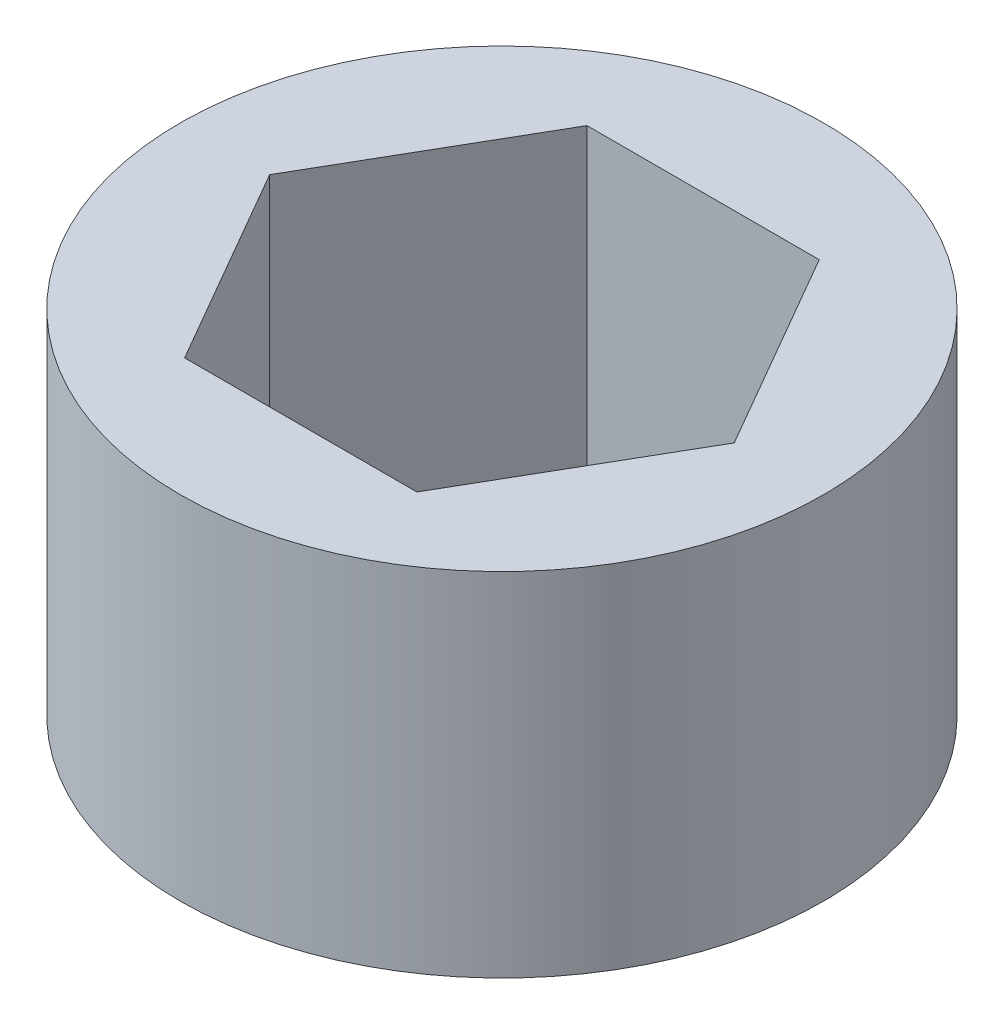
ISO-10303-21;
HEADER;
FILE_DESCRIPTION(('STEP AP214'),'2;1');
FILE_NAME('part.step','',(''),(''),'','','');
FILE_SCHEMA(('AUTOMOTIVE_DESIGN { 1 0 10303 214 1 1 1 1 }'));
ENDSEC;
DATA;
#1=APPLICATION_CONTEXT('core data for automotive mechanical design processes');
#2=APPLICATION_PROTOCOL_DEFINITION('international standard','automotive_design',2000,#1);
#3=PRODUCT_CONTEXT('',#1,'mechanical');
#4=PRODUCT('Part','Part','',(#3));
#5=PRODUCT_RELATED_PRODUCT_CATEGORY('part','',(#4));
#6=PRODUCT_DEFINITION_FORMATION('','',#4);
#7=PRODUCT_DEFINITION_CONTEXT('part definition',#1,'design');
#8=PRODUCT_DEFINITION('design','',#6,#7);
#9=PRODUCT_DEFINITION_SHAPE('','',#8);
#10=(LENGTH_UNIT() NAMED_UNIT(*) SI_UNIT(.MILLI.,.METRE.));
#11=(NAMED_UNIT(*) PLANE_ANGLE_UNIT() SI_UNIT($,.RADIAN.));
#12=(NAMED_UNIT(*) SI_UNIT($,.STERADIAN.) SOLID_ANGLE_UNIT());
#13=UNCERTAINTY_MEASURE_WITH_UNIT(LENGTH_MEASURE(1.E-05),#10,'distance_accuracy_value','');
#14=(GEOMETRIC_REPRESENTATION_CONTEXT(3) GLOBAL_UNCERTAINTY_ASSIGNED_CONTEXT((#13)) GLOBAL_UNIT_ASSIGNED_CONTEXT((#10,
#11,#12)) REPRESENTATION_CONTEXT('',''));
#15=CARTESIAN_POINT('',(0.,0.,0.));
#16=DIRECTION('',(0.,0.,1.));
#17=DIRECTION('',(1.,0.,0.));
#18=AXIS2_PLACEMENT_3D('',#15,#16,#17);
#19=CARTESIAN_POINT('',(0.,11.1125,0.));
#20=DIRECTION('',(0.,1.,0.));
#21=DIRECTION('',(0.,0.,1.));
#22=AXIS2_PLACEMENT_3D('',#19,#20,#21);
#23=PLANE('',#22);
#24=CARTESIAN_POINT('',(0.,11.1125,0.));
#25=DIRECTION('',(0.,1.,0.));
#26=DIRECTION('',(0.,0.,1.));
#27=AXIS2_PLACEMENT_3D('',#24,#25,#26);
#28=CIRCLE('',#27,10.16);
#29=CARTESIAN_POINT('',(0.,11.1125,10.16));
#30=VERTEX_POINT('',#29);
#31=EDGE_CURVE('E11',#30,#30,#28,.T.);
#32=ORIENTED_EDGE('',*,*,#31,.T.);
#33=EDGE_LOOP('',(#32));
#34=FACE_BOUND('',#33,.T.);
#35=DIRECTION('',(0.5,0.,-0.866025403784438));
#36=VECTOR('',#35,1.);
#37=CARTESIAN_POINT('',(3.66617420935412,11.1125,6.35));
#38=LINE('',#37,#36);
#39=CARTESIAN_POINT('',(3.66617420935412,11.1125,6.35));
#40=VERTEX_POINT('',#39);
#41=CARTESIAN_POINT('',(7.33234841870825,11.1125,0.));
#42=VERTEX_POINT('',#41);
#43=EDGE_CURVE('E102',#40,#42,#38,.T.);
#44=ORIENTED_EDGE('',*,*,#43,.F.);
#45=DIRECTION('',(1.,0.,0.));
#46=VECTOR('',#45,1.);
#47=CARTESIAN_POINT('',(-3.66617420935412,11.1125,6.35));
#48=LINE('',#47,#46);
#49=CARTESIAN_POINT('',(-3.66617420935412,11.1125,6.35));
#50=VERTEX_POINT('',#49);
#51=EDGE_CURVE('E93',#50,#40,#48,.T.);
#52=ORIENTED_EDGE('',*,*,#51,.F.);
#53=DIRECTION('',(0.5,0.,0.866025403784438));
#54=VECTOR('',#53,1.);
#55=CARTESIAN_POINT('',(-7.33234841870825,11.1125,0.));
#56=LINE('',#55,#54);
#57=CARTESIAN_POINT('',(-7.33234841870825,11.1125,0.));
#58=VERTEX_POINT('',#57);
#59=EDGE_CURVE('E127',#58,#50,#56,.T.);
#60=ORIENTED_EDGE('',*,*,#59,.F.);
#61=DIRECTION('',(-0.5,0.,0.866025403784439));
#62=VECTOR('',#61,1.);
#63=CARTESIAN_POINT('',(-3.66617420935413,11.1125,-6.35));
#64=LINE('',#63,#62);
#65=CARTESIAN_POINT('',(-3.66617420935413,11.1125,-6.35));
#66=VERTEX_POINT('',#65);
#67=EDGE_CURVE('E124',#66,#58,#64,.T.);
#68=ORIENTED_EDGE('',*,*,#67,.F.);
#69=DIRECTION('',(-1.,0.,0.));
#70=VECTOR('',#69,1.);
#71=CARTESIAN_POINT('',(3.66617420935412,11.1125,-6.35));
#72=LINE('',#71,#70);
#73=CARTESIAN_POINT('',(3.66617420935412,11.1125,-6.35));
#74=VERTEX_POINT('',#73);
#75=EDGE_CURVE('E119',#74,#66,#72,.T.);
#76=ORIENTED_EDGE('',*,*,#75,.F.);
#77=DIRECTION('',(-0.5,0.,-0.866025403784439));
#78=VECTOR('',#77,1.);
#79=CARTESIAN_POINT('',(7.33234841870825,11.1125,0.));
#80=LINE('',#79,#78);
#81=EDGE_CURVE('E115',#42,#74,#80,.T.);
#82=ORIENTED_EDGE('',*,*,#81,.F.);
#83=EDGE_LOOP('',(#44,#52,#60,#68,#76,#82));
#84=FACE_BOUND('',#83,.T.);
#85=ADVANCED_FACE('F39',(#34,#84),#23,.T.);
#86=CARTESIAN_POINT('',(0.,0.,0.));
#87=DIRECTION('',(0.,1.,0.));
#88=DIRECTION('',(0.,0.,1.));
#89=AXIS2_PLACEMENT_3D('',#86,#87,#88);
#90=PLANE('',#89);
#91=CARTESIAN_POINT('',(0.,0.,0.));
#92=DIRECTION('',(0.,1.,0.));
#93=DIRECTION('',(0.,0.,1.));
#94=AXIS2_PLACEMENT_3D('',#91,#92,#93);
#95=CIRCLE('',#94,10.16);
#96=CARTESIAN_POINT('',(0.,0.,10.16));
#97=VERTEX_POINT('',#96);
#98=EDGE_CURVE('E43',#97,#97,#95,.T.);
#99=ORIENTED_EDGE('',*,*,#98,.F.);
#100=EDGE_LOOP('',(#99));
#101=FACE_BOUND('',#100,.T.);
#102=DIRECTION('',(1.,0.,0.));
#103=VECTOR('',#102,1.);
#104=CARTESIAN_POINT('',(-3.66617420935412,0.,6.35));
#105=LINE('',#104,#103);
#106=CARTESIAN_POINT('',(-3.66617420935412,0.,6.35));
#107=VERTEX_POINT('',#106);
#108=CARTESIAN_POINT('',(3.66617420935412,0.,6.35));
#109=VERTEX_POINT('',#108);
#110=EDGE_CURVE('E63',#107,#109,#105,.T.);
#111=ORIENTED_EDGE('',*,*,#110,.T.);
#112=DIRECTION('',(0.5,0.,-0.866025403784438));
#113=VECTOR('',#112,1.);
#114=CARTESIAN_POINT('',(3.66617420935412,0.,6.35));
#115=LINE('',#114,#113);
#116=CARTESIAN_POINT('',(7.33234841870825,0.,0.));
#117=VERTEX_POINT('',#116);
#118=EDGE_CURVE('E109',#109,#117,#115,.T.);
#119=ORIENTED_EDGE('',*,*,#118,.T.);
#120=DIRECTION('',(-0.5,0.,-0.866025403784439));
#121=VECTOR('',#120,1.);
#122=CARTESIAN_POINT('',(7.33234841870825,0.,0.));
#123=LINE('',#122,#121);
#124=CARTESIAN_POINT('',(3.66617420935412,0.,-6.35));
#125=VERTEX_POINT('',#124);
#126=EDGE_CURVE('E134',#117,#125,#123,.T.);
#127=ORIENTED_EDGE('',*,*,#126,.T.);
#128=DIRECTION('',(-1.,0.,0.));
#129=VECTOR('',#128,1.);
#130=CARTESIAN_POINT('',(3.66617420935412,0.,-6.35));
#131=LINE('',#130,#129);
#132=CARTESIAN_POINT('',(-3.66617420935413,0.,-6.35));
#133=VERTEX_POINT('',#132);
#134=EDGE_CURVE('E138',#125,#133,#131,.T.);
#135=ORIENTED_EDGE('',*,*,#134,.T.);
#136=DIRECTION('',(-0.5,0.,0.866025403784439));
#137=VECTOR('',#136,1.);
#138=CARTESIAN_POINT('',(-3.66617420935413,0.,-6.35));
#139=LINE('',#138,#137);
#140=CARTESIAN_POINT('',(-7.33234841870825,0.,0.));
#141=VERTEX_POINT('',#140);
#142=EDGE_CURVE('E142',#133,#141,#139,.T.);
#143=ORIENTED_EDGE('',*,*,#142,.T.);
#144=DIRECTION('',(0.5,0.,0.866025403784438));
#145=VECTOR('',#144,1.);
#146=CARTESIAN_POINT('',(-7.33234841870825,0.,0.));
#147=LINE('',#146,#145);
#148=EDGE_CURVE('E103',#141,#107,#147,.T.);
#149=ORIENTED_EDGE('',*,*,#148,.T.);
#150=EDGE_LOOP('',(#111,#119,#127,#135,#143,#149));
#151=FACE_BOUND('',#150,.T.);
#152=ADVANCED_FACE('F166',(#101,#151),#90,.F.);
#153=CARTESIAN_POINT('',(0.,11.1125,0.));
#154=DIRECTION('',(0.,-1.,0.));
#155=DIRECTION('',(0.,0.,-1.));
#156=AXIS2_PLACEMENT_3D('',#153,#154,#155);
#157=CYLINDRICAL_SURFACE('',#156,10.16);
#158=ORIENTED_EDGE('',*,*,#31,.F.);
#159=EDGE_LOOP('',(#158));
#160=FACE_BOUND('',#159,.T.);
#161=ORIENTED_EDGE('',*,*,#98,.T.);
#162=EDGE_LOOP('',(#161));
#163=FACE_BOUND('',#162,.T.);
#164=ADVANCED_FACE('F41',(#160,#163),#157,.T.);
#165=CARTESIAN_POINT('',(-3.66617420935412,11.1125,6.35));
#166=DIRECTION('',(0.,0.,-1.));
#167=DIRECTION('',(-1.,0.,0.));
#168=AXIS2_PLACEMENT_3D('',#165,#166,#167);
#169=PLANE('',#168);
#170=ORIENTED_EDGE('',*,*,#110,.F.);
#171=DIRECTION('',(0.,-1.,0.));
#172=VECTOR('',#171,1.);
#173=CARTESIAN_POINT('',(-3.66617420935412,11.1125,6.35));
#174=LINE('',#173,#172);
#175=EDGE_CURVE('E97',#50,#107,#174,.T.);
#176=ORIENTED_EDGE('',*,*,#175,.F.);
#177=ORIENTED_EDGE('',*,*,#51,.T.);
#178=DIRECTION('',(0.,-1.,0.));
#179=VECTOR('',#178,1.);
#180=CARTESIAN_POINT('',(3.66617420935412,11.1125,6.35));
#181=LINE('',#180,#179);
#182=EDGE_CURVE('E96',#40,#109,#181,.T.);
#183=ORIENTED_EDGE('',*,*,#182,.T.);
#184=EDGE_LOOP('',(#170,#176,#177,#183));
#185=FACE_BOUND('',#184,.T.);
#186=ADVANCED_FACE('F95',(#185),#169,.T.);
#187=CARTESIAN_POINT('',(3.66617420935412,11.1125,6.35));
#188=DIRECTION('',(-0.866025403784438,0.,-0.5));
#189=DIRECTION('',(-0.5,0.,0.866025403784439));
#190=AXIS2_PLACEMENT_3D('',#187,#188,#189);
#191=PLANE('',#190);
#192=ORIENTED_EDGE('',*,*,#118,.F.);
#193=ORIENTED_EDGE('',*,*,#182,.F.);
#194=ORIENTED_EDGE('',*,*,#43,.T.);
#195=DIRECTION('',(0.,-1.,0.));
#196=VECTOR('',#195,1.);
#197=CARTESIAN_POINT('',(7.33234841870825,11.1125,0.));
#198=LINE('',#197,#196);
#199=EDGE_CURVE('E111',#42,#117,#198,.T.);
#200=ORIENTED_EDGE('',*,*,#199,.T.);
#201=EDGE_LOOP('',(#192,#193,#194,#200));
#202=FACE_BOUND('',#201,.T.);
#203=ADVANCED_FACE('F106',(#202),#191,.T.);
#204=CARTESIAN_POINT('',(7.33234841870825,11.1125,0.));
#205=DIRECTION('',(-0.866025403784438,0.,0.5));
#206=DIRECTION('',(0.5,0.,0.866025403784439));
#207=AXIS2_PLACEMENT_3D('',#204,#205,#206);
#208=PLANE('',#207);
#209=ORIENTED_EDGE('',*,*,#126,.F.);
#210=ORIENTED_EDGE('',*,*,#199,.F.);
#211=ORIENTED_EDGE('',*,*,#81,.T.);
#212=DIRECTION('',(0.,-1.,0.));
#213=VECTOR('',#212,1.);
#214=CARTESIAN_POINT('',(3.66617420935412,11.1125,-6.35));
#215=LINE('',#214,#213);
#216=EDGE_CURVE('E156',#74,#125,#215,.T.);
#217=ORIENTED_EDGE('',*,*,#216,.T.);
#218=EDGE_LOOP('',(#209,#210,#211,#217));
#219=FACE_BOUND('',#218,.T.);
#220=ADVANCED_FACE('F162',(#219),#208,.T.);
#221=CARTESIAN_POINT('',(3.66617420935412,11.1125,-6.35));
#222=DIRECTION('',(0.,0.,1.));
#223=DIRECTION('',(1.,0.,0.));
#224=AXIS2_PLACEMENT_3D('',#221,#222,#223);
#225=PLANE('',#224);
#226=ORIENTED_EDGE('',*,*,#134,.F.);
#227=ORIENTED_EDGE('',*,*,#216,.F.);
#228=ORIENTED_EDGE('',*,*,#75,.T.);
#229=DIRECTION('',(0.,-1.,0.));
#230=VECTOR('',#229,1.);
#231=CARTESIAN_POINT('',(-3.66617420935413,11.1125,-6.35));
#232=LINE('',#231,#230);
#233=EDGE_CURVE('E153',#66,#133,#232,.T.);
#234=ORIENTED_EDGE('',*,*,#233,.T.);
#235=EDGE_LOOP('',(#226,#227,#228,#234));
#236=FACE_BOUND('',#235,.T.);
#237=ADVANCED_FACE('F174',(#236),#225,.T.);
#238=CARTESIAN_POINT('',(-3.66617420935413,11.1125,-6.35));
#239=DIRECTION('',(0.866025403784438,0.,0.5));
#240=DIRECTION('',(0.5,0.,-0.866025403784439));
#241=AXIS2_PLACEMENT_3D('',#238,#239,#240);
#242=PLANE('',#241);
#243=ORIENTED_EDGE('',*,*,#142,.F.);
#244=ORIENTED_EDGE('',*,*,#233,.F.);
#245=ORIENTED_EDGE('',*,*,#67,.T.);
#246=DIRECTION('',(0.,-1.,0.));
#247=VECTOR('',#246,1.);
#248=CARTESIAN_POINT('',(-7.33234841870825,11.1125,0.));
#249=LINE('',#248,#247);
#250=EDGE_CURVE('E55',#58,#141,#249,.T.);
#251=ORIENTED_EDGE('',*,*,#250,.T.);
#252=EDGE_LOOP('',(#243,#244,#245,#251));
#253=FACE_BOUND('',#252,.T.);
#254=ADVANCED_FACE('F172',(#253),#242,.T.);
#255=CARTESIAN_POINT('',(-7.33234841870825,11.1125,0.));
#256=DIRECTION('',(0.866025403784438,0.,-0.5));
#257=DIRECTION('',(-0.5,0.,-0.866025403784439));
#258=AXIS2_PLACEMENT_3D('',#255,#256,#257);
#259=PLANE('',#258);
#260=ORIENTED_EDGE('',*,*,#148,.F.);
#261=ORIENTED_EDGE('',*,*,#250,.F.);
#262=ORIENTED_EDGE('',*,*,#59,.T.);
#263=ORIENTED_EDGE('',*,*,#175,.T.);
#264=EDGE_LOOP('',(#260,#261,#262,#263));
#265=FACE_BOUND('',#264,.T.);
#266=ADVANCED_FACE('F168',(#265),#259,.T.);
#267=CLOSED_SHELL('',(#85,#152,#164,#186,#203,#220,#237,#254,#266));
#268=MANIFOLD_SOLID_BREP('B2',#267);
#269=ADVANCED_BREP_SHAPE_REPRESENTATION('',(#18,#268),#14);
#270=SHAPE_DEFINITION_REPRESENTATION(#9,#269);
ENDSEC;
END-ISO-10303-21;
